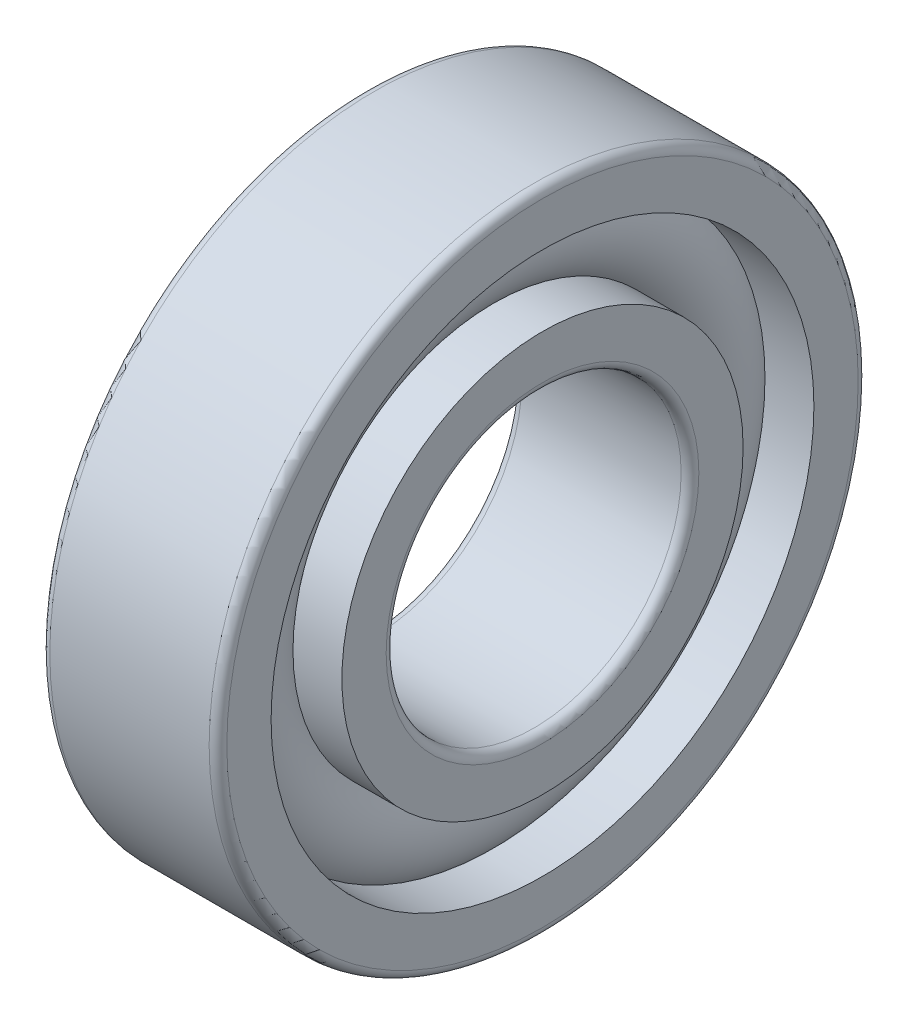
ISO-10303-21;
HEADER;
FILE_DESCRIPTION(('STEP AP214'),'2;1');
FILE_NAME('part.step','',(''),(''),'','','');
FILE_SCHEMA(('AUTOMOTIVE_DESIGN { 1 0 10303 214 1 1 1 1 }'));
ENDSEC;
DATA;
#1=APPLICATION_CONTEXT('core data for automotive mechanical design processes');
#2=APPLICATION_PROTOCOL_DEFINITION('international standard','automotive_design',2000,#1);
#3=PRODUCT_CONTEXT('',#1,'mechanical');
#4=PRODUCT('Part','Part','',(#3));
#5=PRODUCT_RELATED_PRODUCT_CATEGORY('part','',(#4));
#6=PRODUCT_DEFINITION_FORMATION('','',#4);
#7=PRODUCT_DEFINITION_CONTEXT('part definition',#1,'design');
#8=PRODUCT_DEFINITION('design','',#6,#7);
#9=PRODUCT_DEFINITION_SHAPE('','',#8);
#10=(LENGTH_UNIT() NAMED_UNIT(*) SI_UNIT(.MILLI.,.METRE.));
#11=(NAMED_UNIT(*) PLANE_ANGLE_UNIT() SI_UNIT($,.RADIAN.));
#12=(NAMED_UNIT(*) SI_UNIT($,.STERADIAN.) SOLID_ANGLE_UNIT());
#13=UNCERTAINTY_MEASURE_WITH_UNIT(LENGTH_MEASURE(1.E-05),#10,'distance_accuracy_value','');
#14=(GEOMETRIC_REPRESENTATION_CONTEXT(3) GLOBAL_UNCERTAINTY_ASSIGNED_CONTEXT((#13)) GLOBAL_UNIT_ASSIGNED_CONTEXT((#10,
#11,#12)) REPRESENTATION_CONTEXT('',''));
#15=CARTESIAN_POINT('',(0.,0.,0.));
#16=DIRECTION('',(0.,0.,1.));
#17=DIRECTION('',(1.,0.,0.));
#18=AXIS2_PLACEMENT_3D('',#15,#16,#17);
#19=CARTESIAN_POINT('',(0.,0.,0.));
#20=DIRECTION('',(-1.,0.,0.));
#21=DIRECTION('',(0.,0.,1.));
#22=AXIS2_PLACEMENT_3D('',#19,#20,#21);
#23=TOROIDAL_SURFACE('',#22,8.,1.8);
#24=CARTESIAN_POINT('',(1.34164078649987,0.,0.));
#25=DIRECTION('',(-1.,0.,0.));
#26=DIRECTION('',(0.,0.,1.));
#27=AXIS2_PLACEMENT_3D('',#24,#25,#26);
#28=CIRCLE('',#27,9.2);
#29=CARTESIAN_POINT('',(1.34164078649987,0.,9.2));
#30=VERTEX_POINT('',#29);
#31=EDGE_CURVE('E36',#30,#30,#28,.F.);
#32=ORIENTED_EDGE('',*,*,#31,.T.);
#33=EDGE_LOOP('',(#32));
#34=FACE_BOUND('',#33,.T.);
#35=CARTESIAN_POINT('',(1.34164078649987,0.,0.));
#36=DIRECTION('',(-1.,0.,0.));
#37=DIRECTION('',(0.,0.,1.));
#38=AXIS2_PLACEMENT_3D('',#35,#36,#37);
#39=CIRCLE('',#38,6.8);
#40=CARTESIAN_POINT('',(1.34164078649987,0.,6.8));
#41=VERTEX_POINT('',#40);
#42=EDGE_CURVE('E10',#41,#41,#39,.T.);
#43=ORIENTED_EDGE('',*,*,#42,.T.);
#44=EDGE_LOOP('',(#43));
#45=FACE_BOUND('',#44,.T.);
#46=ADVANCED_FACE('F32',(#34,#45),#23,.T.);
#47=CARTESIAN_POINT('',(-20.6375,0.,0.));
#48=DIRECTION('',(1.,0.,0.));
#49=DIRECTION('',(0.,0.,-1.));
#50=AXIS2_PLACEMENT_3D('',#47,#48,#49);
#51=CYLINDRICAL_SURFACE('',#50,6.8);
#52=CARTESIAN_POINT('',(3.,0.,0.));
#53=DIRECTION('',(1.,0.,0.));
#54=DIRECTION('',(0.,0.,-1.));
#55=AXIS2_PLACEMENT_3D('',#52,#53,#54);
#56=CIRCLE('',#55,6.8);
#57=CARTESIAN_POINT('',(3.,0.,-6.8));
#58=VERTEX_POINT('',#57);
#59=EDGE_CURVE('E45',#58,#58,#56,.T.);
#60=ORIENTED_EDGE('',*,*,#59,.F.);
#61=EDGE_LOOP('',(#60));
#62=FACE_BOUND('',#61,.T.);
#63=ORIENTED_EDGE('',*,*,#42,.F.);
#64=EDGE_LOOP('',(#63));
#65=FACE_BOUND('',#64,.T.);
#66=ADVANCED_FACE('F84',(#62,#65),#51,.T.);
#67=CARTESIAN_POINT('',(-20.6375,0.,0.));
#68=DIRECTION('',(1.,0.,0.));
#69=DIRECTION('',(0.,0.,-1.));
#70=AXIS2_PLACEMENT_3D('',#67,#68,#69);
#71=CYLINDRICAL_SURFACE('',#70,6.8);
#72=CARTESIAN_POINT('',(-3.,0.,0.));
#73=DIRECTION('',(1.,0.,0.));
#74=DIRECTION('',(0.,0.,-1.));
#75=AXIS2_PLACEMENT_3D('',#72,#73,#74);
#76=CIRCLE('',#75,6.8);
#77=CARTESIAN_POINT('',(-3.,0.,-6.8));
#78=VERTEX_POINT('',#77);
#79=EDGE_CURVE('E54',#78,#78,#76,.T.);
#80=ORIENTED_EDGE('',*,*,#79,.T.);
#81=EDGE_LOOP('',(#80));
#82=FACE_BOUND('',#81,.T.);
#83=CARTESIAN_POINT('',(-1.34164078649987,0.,0.));
#84=DIRECTION('',(1.,0.,0.));
#85=DIRECTION('',(0.,0.,-1.));
#86=AXIS2_PLACEMENT_3D('',#83,#84,#85);
#87=CIRCLE('',#86,6.8);
#88=CARTESIAN_POINT('',(-1.34164078649987,0.,-6.8));
#89=VERTEX_POINT('',#88);
#90=EDGE_CURVE('E40',#89,#89,#87,.T.);
#91=ORIENTED_EDGE('',*,*,#90,.F.);
#92=EDGE_LOOP('',(#91));
#93=FACE_BOUND('',#92,.T.);
#94=ADVANCED_FACE('F87',(#82,#93),#71,.T.);
#95=CARTESIAN_POINT('',(3.,5.3,0.));
#96=DIRECTION('',(1.,0.,0.));
#97=DIRECTION('',(0.,0.,-1.));
#98=AXIS2_PLACEMENT_3D('',#95,#96,#97);
#99=PLANE('',#98);
#100=ORIENTED_EDGE('',*,*,#59,.T.);
#101=EDGE_LOOP('',(#100));
#102=FACE_BOUND('',#101,.T.);
#103=CARTESIAN_POINT('',(3.,0.,0.));
#104=DIRECTION('',(1.,0.,0.));
#105=DIRECTION('',(0.,0.,-1.));
#106=AXIS2_PLACEMENT_3D('',#103,#104,#105);
#107=CIRCLE('',#106,5.3);
#108=CARTESIAN_POINT('',(3.,0.,-5.3));
#109=VERTEX_POINT('',#108);
#110=EDGE_CURVE('E76',#109,#109,#107,.T.);
#111=ORIENTED_EDGE('',*,*,#110,.F.);
#112=EDGE_LOOP('',(#111));
#113=FACE_BOUND('',#112,.T.);
#114=ADVANCED_FACE('F81',(#102,#113),#99,.T.);
#115=CARTESIAN_POINT('',(2.7,0.,0.));
#116=DIRECTION('',(1.,0.,0.));
#117=DIRECTION('',(0.,0.,-1.));
#118=AXIS2_PLACEMENT_3D('',#115,#116,#117);
#119=TOROIDAL_SURFACE('',#118,5.3,0.3);
#120=ORIENTED_EDGE('',*,*,#110,.T.);
#121=EDGE_LOOP('',(#120));
#122=FACE_BOUND('',#121,.T.);
#123=CARTESIAN_POINT('',(2.7,0.,0.));
#124=DIRECTION('',(1.,0.,0.));
#125=DIRECTION('',(0.,0.,-1.));
#126=AXIS2_PLACEMENT_3D('',#123,#124,#125);
#127=CIRCLE('',#126,5.);
#128=CARTESIAN_POINT('',(2.7,0.,-5.));
#129=VERTEX_POINT('',#128);
#130=EDGE_CURVE('E73',#129,#129,#127,.T.);
#131=ORIENTED_EDGE('',*,*,#130,.F.);
#132=EDGE_LOOP('',(#131));
#133=FACE_BOUND('',#132,.T.);
#134=ADVANCED_FACE('F98',(#122,#133),#119,.T.);
#135=CARTESIAN_POINT('',(-20.6375,0.,0.));
#136=DIRECTION('',(1.,0.,0.));
#137=DIRECTION('',(0.,0.,-1.));
#138=AXIS2_PLACEMENT_3D('',#135,#136,#137);
#139=CYLINDRICAL_SURFACE('',#138,5.);
#140=ORIENTED_EDGE('',*,*,#130,.T.);
#141=EDGE_LOOP('',(#140));
#142=FACE_BOUND('',#141,.T.);
#143=CARTESIAN_POINT('',(-2.7,0.,0.));
#144=DIRECTION('',(1.,0.,0.));
#145=DIRECTION('',(0.,0.,-1.));
#146=AXIS2_PLACEMENT_3D('',#143,#144,#145);
#147=CIRCLE('',#146,5.);
#148=CARTESIAN_POINT('',(-2.7,0.,-5.));
#149=VERTEX_POINT('',#148);
#150=EDGE_CURVE('E70',#149,#149,#147,.T.);
#151=ORIENTED_EDGE('',*,*,#150,.F.);
#152=EDGE_LOOP('',(#151));
#153=FACE_BOUND('',#152,.T.);
#154=ADVANCED_FACE('F101',(#142,#153),#139,.F.);
#155=CARTESIAN_POINT('',(-2.7,0.,0.));
#156=DIRECTION('',(1.,0.,0.));
#157=DIRECTION('',(0.,0.,-1.));
#158=AXIS2_PLACEMENT_3D('',#155,#156,#157);
#159=TOROIDAL_SURFACE('',#158,5.3,0.3);
#160=ORIENTED_EDGE('',*,*,#150,.T.);
#161=EDGE_LOOP('',(#160));
#162=FACE_BOUND('',#161,.T.);
#163=CARTESIAN_POINT('',(-3.,0.,0.));
#164=DIRECTION('',(1.,0.,0.));
#165=DIRECTION('',(0.,0.,-1.));
#166=AXIS2_PLACEMENT_3D('',#163,#164,#165);
#167=CIRCLE('',#166,5.3);
#168=CARTESIAN_POINT('',(-3.,0.,-5.3));
#169=VERTEX_POINT('',#168);
#170=EDGE_CURVE('E67',#169,#169,#167,.T.);
#171=ORIENTED_EDGE('',*,*,#170,.F.);
#172=EDGE_LOOP('',(#171));
#173=FACE_BOUND('',#172,.T.);
#174=ADVANCED_FACE('F105',(#162,#173),#159,.T.);
#175=CARTESIAN_POINT('',(-3.,6.8,0.));
#176=DIRECTION('',(-1.,0.,0.));
#177=DIRECTION('',(0.,0.,1.));
#178=AXIS2_PLACEMENT_3D('',#175,#176,#177);
#179=PLANE('',#178);
#180=ORIENTED_EDGE('',*,*,#170,.T.);
#181=EDGE_LOOP('',(#180));
#182=FACE_BOUND('',#181,.T.);
#183=ORIENTED_EDGE('',*,*,#79,.F.);
#184=EDGE_LOOP('',(#183));
#185=FACE_BOUND('',#184,.T.);
#186=ADVANCED_FACE('F109',(#182,#185),#179,.T.);
#187=CARTESIAN_POINT('',(-1.34164078649987,0.,0.));
#188=DIRECTION('',(1.,0.,0.));
#189=DIRECTION('',(0.,0.,-1.));
#190=AXIS2_PLACEMENT_3D('',#187,#188,#189);
#191=CIRCLE('',#190,9.2);
#192=CARTESIAN_POINT('',(-1.34164078649987,0.,-9.2));
#193=VERTEX_POINT('',#192);
#194=EDGE_CURVE('E48',#193,#193,#191,.F.);
#195=ORIENTED_EDGE('',*,*,#194,.T.);
#196=EDGE_LOOP('',(#195));
#197=FACE_BOUND('',#196,.T.);
#198=ORIENTED_EDGE('',*,*,#90,.T.);
#199=EDGE_LOOP('',(#198));
#200=FACE_BOUND('',#199,.T.);
#201=ADVANCED_FACE('F34',(#197,#200),#23,.T.);
#202=CARTESIAN_POINT('',(-20.6375,0.,0.));
#203=DIRECTION('',(1.,0.,0.));
#204=DIRECTION('',(0.,0.,-1.));
#205=AXIS2_PLACEMENT_3D('',#202,#203,#204);
#206=CYLINDRICAL_SURFACE('',#205,9.2);
#207=CARTESIAN_POINT('',(3.,0.,0.));
#208=DIRECTION('',(1.,0.,0.));
#209=DIRECTION('',(0.,0.,-1.));
#210=AXIS2_PLACEMENT_3D('',#207,#208,#209);
#211=CIRCLE('',#210,9.2);
#212=CARTESIAN_POINT('',(3.,0.,-9.2));
#213=VERTEX_POINT('',#212);
#214=EDGE_CURVE('E50',#213,#213,#211,.T.);
#215=ORIENTED_EDGE('',*,*,#214,.T.);
#216=EDGE_LOOP('',(#215));
#217=FACE_BOUND('',#216,.T.);
#218=ORIENTED_EDGE('',*,*,#31,.F.);
#219=EDGE_LOOP('',(#218));
#220=FACE_BOUND('',#219,.T.);
#221=ADVANCED_FACE('F114',(#217,#220),#206,.F.);
#222=CARTESIAN_POINT('',(-20.6375,0.,0.));
#223=DIRECTION('',(1.,0.,0.));
#224=DIRECTION('',(0.,0.,-1.));
#225=AXIS2_PLACEMENT_3D('',#222,#223,#224);
#226=CYLINDRICAL_SURFACE('',#225,9.2);
#227=CARTESIAN_POINT('',(-3.,0.,0.));
#228=DIRECTION('',(1.,0.,0.));
#229=DIRECTION('',(0.,0.,-1.));
#230=AXIS2_PLACEMENT_3D('',#227,#228,#229);
#231=CIRCLE('',#230,9.2);
#232=CARTESIAN_POINT('',(-3.,0.,-9.2));
#233=VERTEX_POINT('',#232);
#234=EDGE_CURVE('E145',#233,#233,#231,.T.);
#235=ORIENTED_EDGE('',*,*,#234,.F.);
#236=EDGE_LOOP('',(#235));
#237=FACE_BOUND('',#236,.T.);
#238=ORIENTED_EDGE('',*,*,#194,.F.);
#239=EDGE_LOOP('',(#238));
#240=FACE_BOUND('',#239,.T.);
#241=ADVANCED_FACE('F117',(#237,#240),#226,.F.);
#242=CARTESIAN_POINT('',(3.,10.7,0.));
#243=DIRECTION('',(1.,0.,0.));
#244=DIRECTION('',(0.,0.,-1.));
#245=AXIS2_PLACEMENT_3D('',#242,#243,#244);
#246=PLANE('',#245);
#247=CARTESIAN_POINT('',(3.,0.,0.));
#248=DIRECTION('',(1.,0.,0.));
#249=DIRECTION('',(0.,0.,-1.));
#250=AXIS2_PLACEMENT_3D('',#247,#248,#249);
#251=CIRCLE('',#250,10.7);
#252=CARTESIAN_POINT('',(3.,0.,-10.7));
#253=VERTEX_POINT('',#252);
#254=EDGE_CURVE('E56',#253,#253,#251,.T.);
#255=ORIENTED_EDGE('',*,*,#254,.T.);
#256=EDGE_LOOP('',(#255));
#257=FACE_BOUND('',#256,.T.);
#258=ORIENTED_EDGE('',*,*,#214,.F.);
#259=EDGE_LOOP('',(#258));
#260=FACE_BOUND('',#259,.T.);
#261=ADVANCED_FACE('F118',(#257,#260),#246,.T.);
#262=CARTESIAN_POINT('',(2.7,0.,0.));
#263=DIRECTION('',(1.,0.,0.));
#264=DIRECTION('',(0.,0.,-1.));
#265=AXIS2_PLACEMENT_3D('',#262,#263,#264);
#266=TOROIDAL_SURFACE('',#265,10.7,0.300000000000001);
#267=CARTESIAN_POINT('',(2.7,0.,0.));
#268=DIRECTION('',(1.,0.,0.));
#269=DIRECTION('',(0.,0.,-1.));
#270=AXIS2_PLACEMENT_3D('',#267,#268,#269);
#271=CIRCLE('',#270,11.);
#272=CARTESIAN_POINT('',(2.7,0.,-11.));
#273=VERTEX_POINT('',#272);
#274=EDGE_CURVE('E61',#273,#273,#271,.T.);
#275=ORIENTED_EDGE('',*,*,#274,.T.);
#276=EDGE_LOOP('',(#275));
#277=FACE_BOUND('',#276,.T.);
#278=ORIENTED_EDGE('',*,*,#254,.F.);
#279=EDGE_LOOP('',(#278));
#280=FACE_BOUND('',#279,.T.);
#281=ADVANCED_FACE('F121',(#277,#280),#266,.T.);
#282=CARTESIAN_POINT('',(-20.6375,0.,0.));
#283=DIRECTION('',(1.,0.,0.));
#284=DIRECTION('',(0.,0.,-1.));
#285=AXIS2_PLACEMENT_3D('',#282,#283,#284);
#286=CYLINDRICAL_SURFACE('',#285,11.);
#287=CARTESIAN_POINT('',(-2.7,0.,0.));
#288=DIRECTION('',(1.,0.,0.));
#289=DIRECTION('',(0.,0.,-1.));
#290=AXIS2_PLACEMENT_3D('',#287,#288,#289);
#291=CIRCLE('',#290,11.);
#292=CARTESIAN_POINT('',(-2.7,0.,-11.));
#293=VERTEX_POINT('',#292);
#294=EDGE_CURVE('E149',#293,#293,#291,.T.);
#295=ORIENTED_EDGE('',*,*,#294,.T.);
#296=EDGE_LOOP('',(#295));
#297=FACE_BOUND('',#296,.T.);
#298=ORIENTED_EDGE('',*,*,#274,.F.);
#299=EDGE_LOOP('',(#298));
#300=FACE_BOUND('',#299,.T.);
#301=ADVANCED_FACE('F125',(#297,#300),#286,.T.);
#302=CARTESIAN_POINT('',(-2.7,0.,0.));
#303=DIRECTION('',(1.,0.,0.));
#304=DIRECTION('',(0.,0.,-1.));
#305=AXIS2_PLACEMENT_3D('',#302,#303,#304);
#306=TOROIDAL_SURFACE('',#305,10.7,0.300000000000001);
#307=CARTESIAN_POINT('',(-3.,0.,0.));
#308=DIRECTION('',(1.,0.,0.));
#309=DIRECTION('',(0.,0.,-1.));
#310=AXIS2_PLACEMENT_3D('',#307,#308,#309);
#311=CIRCLE('',#310,10.7);
#312=CARTESIAN_POINT('',(-3.,0.,-10.7));
#313=VERTEX_POINT('',#312);
#314=EDGE_CURVE('E146',#313,#313,#311,.T.);
#315=ORIENTED_EDGE('',*,*,#314,.T.);
#316=EDGE_LOOP('',(#315));
#317=FACE_BOUND('',#316,.T.);
#318=ORIENTED_EDGE('',*,*,#294,.F.);
#319=EDGE_LOOP('',(#318));
#320=FACE_BOUND('',#319,.T.);
#321=ADVANCED_FACE('F129',(#317,#320),#306,.T.);
#322=CARTESIAN_POINT('',(-3.,9.2,0.));
#323=DIRECTION('',(-1.,0.,0.));
#324=DIRECTION('',(0.,0.,1.));
#325=AXIS2_PLACEMENT_3D('',#322,#323,#324);
#326=PLANE('',#325);
#327=ORIENTED_EDGE('',*,*,#234,.T.);
#328=EDGE_LOOP('',(#327));
#329=FACE_BOUND('',#328,.T.);
#330=ORIENTED_EDGE('',*,*,#314,.F.);
#331=EDGE_LOOP('',(#330));
#332=FACE_BOUND('',#331,.T.);
#333=ADVANCED_FACE('F133',(#329,#332),#326,.T.);
#334=CLOSED_SHELL('',(#46,#66,#94,#114,#134,#154,#174,#186,#201,#221,#241,#261,#281,#301,#321,#333));
#335=MANIFOLD_SOLID_BREP('B2',#334);
#336=ADVANCED_BREP_SHAPE_REPRESENTATION('',(#18,#335),#14);
#337=SHAPE_DEFINITION_REPRESENTATION(#9,#336);
ENDSEC;
END-ISO-10303-21;
